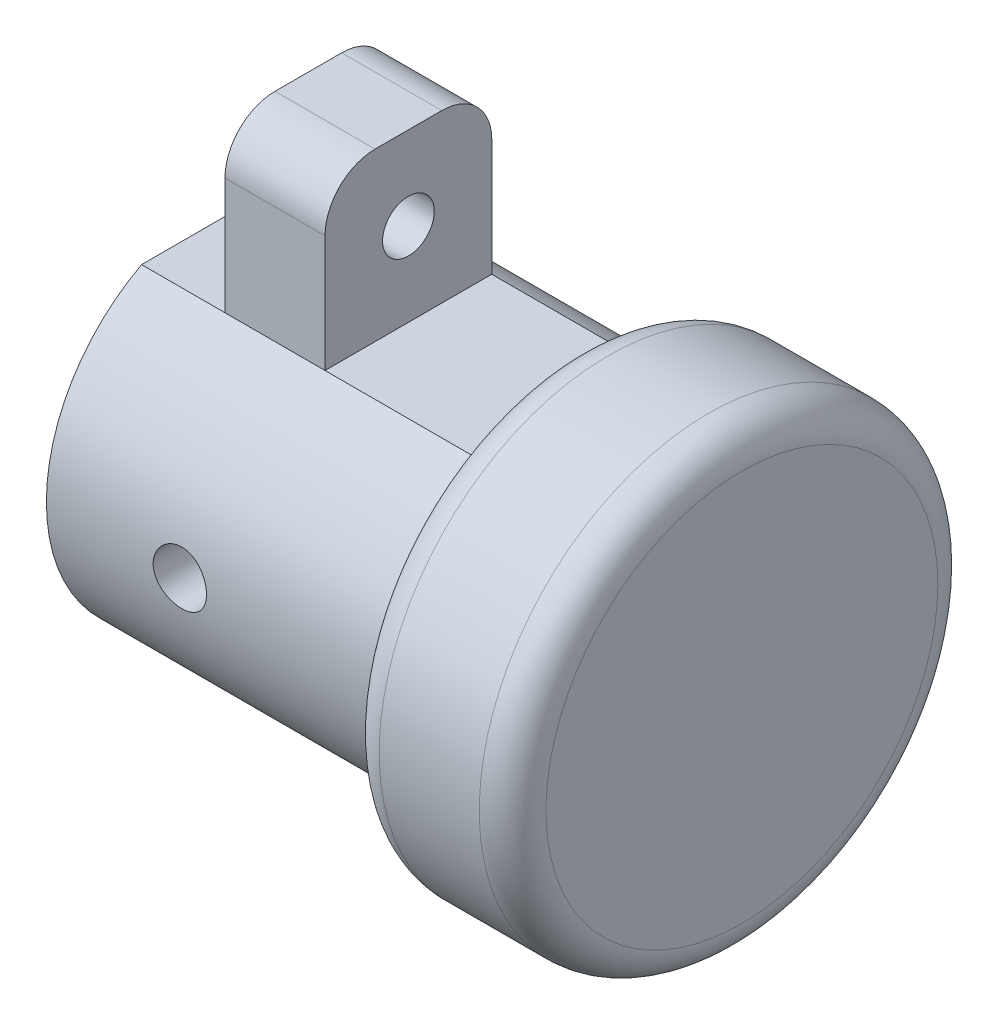
ISO-10303-21;
HEADER;
FILE_DESCRIPTION(('STEP AP214'),'2;1');
FILE_NAME('part.step','',(''),(''),'','','');
FILE_SCHEMA(('AUTOMOTIVE_DESIGN { 1 0 10303 214 1 1 1 1 }'));
ENDSEC;
DATA;
#1=APPLICATION_CONTEXT('core data for automotive mechanical design processes');
#2=APPLICATION_PROTOCOL_DEFINITION('international standard','automotive_design',2000,#1);
#3=PRODUCT_CONTEXT('',#1,'mechanical');
#4=PRODUCT('Part','Part','',(#3));
#5=PRODUCT_RELATED_PRODUCT_CATEGORY('part','',(#4));
#6=PRODUCT_DEFINITION_FORMATION('','',#4);
#7=PRODUCT_DEFINITION_CONTEXT('part definition',#1,'design');
#8=PRODUCT_DEFINITION('design','',#6,#7);
#9=PRODUCT_DEFINITION_SHAPE('','',#8);
#10=(LENGTH_UNIT() NAMED_UNIT(*) SI_UNIT(.MILLI.,.METRE.));
#11=(NAMED_UNIT(*) PLANE_ANGLE_UNIT() SI_UNIT($,.RADIAN.));
#12=(NAMED_UNIT(*) SI_UNIT($,.STERADIAN.) SOLID_ANGLE_UNIT());
#13=UNCERTAINTY_MEASURE_WITH_UNIT(LENGTH_MEASURE(1.E-05),#10,'distance_accuracy_value','');
#14=(GEOMETRIC_REPRESENTATION_CONTEXT(3) GLOBAL_UNCERTAINTY_ASSIGNED_CONTEXT((#13)) GLOBAL_UNIT_ASSIGNED_CONTEXT((#10,
#11,#12)) REPRESENTATION_CONTEXT('',''));
#15=CARTESIAN_POINT('',(0.,0.,0.));
#16=DIRECTION('',(0.,0.,1.));
#17=DIRECTION('',(1.,0.,0.));
#18=AXIS2_PLACEMENT_3D('',#15,#16,#17);
#19=CARTESIAN_POINT('',(16.,0.,0.));
#20=DIRECTION('',(-1.,0.,0.));
#21=DIRECTION('',(0.,0.,1.));
#22=AXIS2_PLACEMENT_3D('',#19,#20,#21);
#23=CYLINDRICAL_SURFACE('',#22,10.71);
#24=CARTESIAN_POINT('',(9.6,0.,10.71));
#25=CARTESIAN_POINT('',(9.59999631249962,-0.0893392863377918,10.709998572173));
#26=CARTESIAN_POINT('',(9.59249207613877,-0.178730516813415,10.7088704242097));
#27=CARTESIAN_POINT('',(9.56268083749038,-0.355014654532013,10.7044785929941));
#28=CARTESIAN_POINT('',(9.54035939450645,-0.441905038197179,10.7012128264842));
#29=CARTESIAN_POINT('',(9.48159535241211,-0.610610764880122,10.6929127804514));
#30=CARTESIAN_POINT('',(9.44516339569907,-0.69242987891695,10.6878798340334));
#31=CARTESIAN_POINT('',(9.35923843142557,-0.848780811301311,10.676601662275));
#32=CARTESIAN_POINT('',(9.30974724899632,-0.923313645971321,10.6703566063689));
#33=CARTESIAN_POINT('',(9.19869991100803,-1.06356662724988,10.6572946268811));
#34=CARTESIAN_POINT('',(9.13706251132156,-1.12922211326353,10.6504740397194));
#35=CARTESIAN_POINT('',(9.003647216643,-1.24929882645103,10.6370584182013));
#36=CARTESIAN_POINT('',(8.93186874062551,-1.30371940948946,10.6304633967953));
#37=CARTESIAN_POINT('',(8.77977473601831,-1.40003294470998,10.6182100523691));
#38=CARTESIAN_POINT('',(8.69941920835304,-1.44186338669871,10.6125564635773));
#39=CARTESIAN_POINT('',(8.53272434767541,-1.51140975635126,10.6028760739138));
#40=CARTESIAN_POINT('',(8.44638533842369,-1.53912644702067,10.5988491851034));
#41=CARTESIAN_POINT('',(8.27085416744198,-1.57945783802606,10.5929141208681));
#42=CARTESIAN_POINT('',(8.18168796631694,-1.59218319952214,10.5909904280236));
#43=CARTESIAN_POINT('',(8.00246662496982,-1.60251351325176,10.5894324415377));
#44=CARTESIAN_POINT('',(7.91241153567316,-1.60011932673892,10.5897980174929));
#45=CARTESIAN_POINT('',(7.73475020113145,-1.58036895177812,10.5927630734712));
#46=CARTESIAN_POINT('',(7.64712990709656,-1.56313597738507,10.5953441564517));
#47=CARTESIAN_POINT('',(7.47603862256453,-1.51439007005342,10.6024206653419));
#48=CARTESIAN_POINT('',(7.39256774865218,-1.48287673613596,10.6069161450059));
#49=CARTESIAN_POINT('',(7.23176964314886,-1.40633639408911,10.6173352540808));
#50=CARTESIAN_POINT('',(7.15446764222673,-1.36125716024578,10.6232643850783));
#51=CARTESIAN_POINT('',(7.00847853243833,-1.25890185076179,10.6358787482093));
#52=CARTESIAN_POINT('',(6.93979198495068,-1.20162498098466,10.6425640295593));
#53=CARTESIAN_POINT('',(6.81226941190883,-1.07582376829839,10.6560187260662));
#54=CARTESIAN_POINT('',(6.75353786689812,-1.00719348310619,10.662788317938));
#55=CARTESIAN_POINT('',(6.6484104361485,-0.860994778274062,10.675587267449));
#56=CARTESIAN_POINT('',(6.60201460364155,-0.783426320065532,10.6816166218939));
#57=CARTESIAN_POINT('',(6.5228703697534,-0.621462851975752,10.6922619780988));
#58=CARTESIAN_POINT('',(6.49012998981266,-0.537063864383369,10.6968771487226));
#59=CARTESIAN_POINT('',(6.43931666673816,-0.363881286667943,10.7041671677796));
#60=CARTESIAN_POINT('',(6.42124274010131,-0.275097990971488,10.7068421463169));
#61=CARTESIAN_POINT('',(6.40041421491459,-0.096568814905586,10.7099331601436));
#62=CARTESIAN_POINT('',(6.3975159690397,-0.00684004667508931,10.710370376361));
#63=CARTESIAN_POINT('',(6.4067398486872,0.171822232056323,10.7089942472345));
#64=CARTESIAN_POINT('',(6.41886151308142,0.260755766887371,10.7071809709833));
#65=CARTESIAN_POINT('',(6.45766167787525,0.43486826809352,10.7015207020652));
#66=CARTESIAN_POINT('',(6.4842702335413,0.520063166355989,10.6976834840284));
#67=CARTESIAN_POINT('',(6.55121512885649,0.684782451776511,10.6884042142537));
#68=CARTESIAN_POINT('',(6.59155210867936,0.764306574289937,10.6829620876785));
#69=CARTESIAN_POINT('',(6.68514611618925,0.916058818693131,10.6710251877014));
#70=CARTESIAN_POINT('',(6.73849431198518,0.988230126161438,10.6645230988209));
#71=CARTESIAN_POINT('',(6.85646940804102,1.12264658556525,10.6512128610829));
#72=CARTESIAN_POINT('',(6.92109695821863,1.18489116512579,10.6444046946059));
#73=CARTESIAN_POINT('',(7.06043553976582,1.29820961273836,10.6311825098308));
#74=CARTESIAN_POINT('',(7.13522526498764,1.34918721595353,10.6247722012362));
#75=CARTESIAN_POINT('',(7.29239049178092,1.4378556239892,10.6131371171605));
#76=CARTESIAN_POINT('',(7.37476578962586,1.47554678551391,10.6079123098532));
#77=CARTESIAN_POINT('',(7.54447615867616,1.53642302488711,10.5992666120658));
#78=CARTESIAN_POINT('',(7.63179268897914,1.55965885607379,10.595839416814));
#79=CARTESIAN_POINT('',(7.8091437773277,1.59112643738261,10.5911601832474));
#80=CARTESIAN_POINT('',(7.89917814889041,1.59935921456121,10.5899079960395));
#81=CARTESIAN_POINT('',(8.07844971983847,1.60056270329776,10.589726083362));
#82=CARTESIAN_POINT('',(8.16768591664139,1.59368477278815,10.5907733253654));
#83=CARTESIAN_POINT('',(8.34371736198404,1.56518633674034,10.5950222303468));
#84=CARTESIAN_POINT('',(8.43051261431031,1.54356585407305,10.5982238899825));
#85=CARTESIAN_POINT('',(8.59915700056349,1.48624940224989,10.6064128558492));
#86=CARTESIAN_POINT('',(8.6810097696054,1.45056392673406,10.6113988305799));
#87=CARTESIAN_POINT('',(8.83759085727842,1.36614552510704,10.622596268656));
#88=CARTESIAN_POINT('',(8.91231893849098,1.31741216440238,10.6288077728189));
#89=CARTESIAN_POINT('',(9.05329851906904,1.20773114463465,10.6418304729342));
#90=CARTESIAN_POINT('',(9.11946232293033,1.14667136479746,10.6486468259776));
#91=CARTESIAN_POINT('',(9.24065834371271,1.01430768159209,10.6620680742037));
#92=CARTESIAN_POINT('',(9.29568796883469,0.943001399648168,10.6686729198514));
#93=CARTESIAN_POINT('',(9.39332154312635,0.791711288148564,10.6809681077745));
#94=CARTESIAN_POINT('',(9.43585604455767,0.711682227357587,10.6866532627608));
#95=CARTESIAN_POINT('',(9.50681613891792,0.545568919796068,10.696417602142));
#96=CARTESIAN_POINT('',(9.53525636330006,0.459491058839355,10.7004984510742));
#97=CARTESIAN_POINT('',(9.57075928734636,0.310854646047107,10.7056614964362));
#98=CARTESIAN_POINT('',(9.5817078226596,0.249214106377617,10.7072800907872));
#99=CARTESIAN_POINT('',(9.5963294250377,0.125057522592236,10.7094498357885));
#100=CARTESIAN_POINT('',(9.60000258141491,0.06254148923337,10.7100009995426));
#101=CARTESIAN_POINT('',(9.6,0.,10.71));
#102=B_SPLINE_CURVE_WITH_KNOTS('',3,(#24,#25,#26,#27,#28,#29,#30,#31,#32,#33,#34,#35,#36,#37,
#38,#39,#40,#41,#42,#43,#44,#45,#46,#47,#48,#49,#50,#51,#52,#53,#54,#55,#56,#57,#58,#59,#60,#61,
#62,#63,#64,#65,#66,#67,#68,#69,#70,#71,#72,#73,#74,#75,#76,#77,#78,#79,#80,#81,#82,#83,#84,#85,
#86,#87,#88,#89,#90,#91,#92,#93,#94,#95,#96,#97,#98,#99,#100,#101),.UNSPECIFIED.,.T.,.F.,(4,2,2,
2,2,2,2,2,2,2,2,2,2,2,2,2,2,2,2,2,2,2,2,2,2,2,2,2,2,2,2,2,2,2,2,2,2,2,4),(0.,0.267789327919353,
0.535840024473879,0.803688944938174,1.07150045118321,1.34116814235607,1.61085129020878,
1.88185213070942,2.15283831903803,2.42181138493036,2.69076912946943,2.95751488264728,
3.22426812625544,3.49206174173954,3.75987279746638,4.03034063846066,4.30080964657879,
4.57143730969666,4.84204682356337,5.11009015687831,5.37812526116516,5.64487758488071,
5.91164234929817,6.18033289726733,6.44903893233175,6.7199589270328,6.99087164772735,
7.26082773206369,7.53076533545912,7.79801141987221,8.06525708969322,8.33230374857829,
8.59935930324803,8.86896331738754,9.13863001756641,9.40976833252188,9.68062458252903,
9.86809136961154,10.0555558553424),.UNSPECIFIED.);
#103=CARTESIAN_POINT('',(9.6,0.,10.71));
#104=VERTEX_POINT('',#103);
#105=EDGE_CURVE('E211',#104,#104,#102,.T.);
#106=ORIENTED_EDGE('',*,*,#105,.T.);
#107=EDGE_LOOP('',(#106));
#108=FACE_BOUND('',#107,.T.);
#109=CARTESIAN_POINT('',(9.6,0.,-10.71));
#110=CARTESIAN_POINT('',(9.59999631249962,0.089339286337799,-10.709998572173));
#111=CARTESIAN_POINT('',(9.59249207613877,0.178730516813422,-10.7088704242097));
#112=CARTESIAN_POINT('',(9.56268083749038,0.35501465453202,-10.7044785929941));
#113=CARTESIAN_POINT('',(9.54035939450645,0.441905038197187,-10.7012128264842));
#114=CARTESIAN_POINT('',(9.48159535241212,0.61061076488013,-10.6929127804514));
#115=CARTESIAN_POINT('',(9.44516339569907,0.692429878916958,-10.6878798340334));
#116=CARTESIAN_POINT('',(9.35923843142558,0.84878081130132,-10.676601662275));
#117=CARTESIAN_POINT('',(9.30974724899633,0.92331364597133,-10.6703566063689));
#118=CARTESIAN_POINT('',(9.19869991100804,1.06356662724989,-10.6572946268811));
#119=CARTESIAN_POINT('',(9.13706251132156,1.12922211326354,-10.6504740397194));
#120=CARTESIAN_POINT('',(9.00364721664301,1.24929882645104,-10.6370584182013));
#121=CARTESIAN_POINT('',(8.93186874062551,1.30371940948947,-10.6304633967953));
#122=CARTESIAN_POINT('',(8.77977473601832,1.40003294470999,-10.6182100523691));
#123=CARTESIAN_POINT('',(8.69941920835305,1.44186338669872,-10.6125564635773));
#124=CARTESIAN_POINT('',(8.53272434767542,1.51140975635128,-10.6028760739138));
#125=CARTESIAN_POINT('',(8.44638533842369,1.53912644702068,-10.5988491851034));
#126=CARTESIAN_POINT('',(8.27085416744198,1.57945783802607,-10.5929141208681));
#127=CARTESIAN_POINT('',(8.18168796631695,1.59218319952215,-10.5909904280236));
#128=CARTESIAN_POINT('',(8.00246662496982,1.60251351325177,-10.5894324415377));
#129=CARTESIAN_POINT('',(7.91241153567316,1.60011932673894,-10.5897980174929));
#130=CARTESIAN_POINT('',(7.73475020113146,1.58036895177814,-10.5927630734712));
#131=CARTESIAN_POINT('',(7.64712990709656,1.56313597738509,-10.5953441564517));
#132=CARTESIAN_POINT('',(7.47603862256453,1.51439007005344,-10.6024206653419));
#133=CARTESIAN_POINT('',(7.39256774865219,1.48287673613598,-10.6069161450059));
#134=CARTESIAN_POINT('',(7.23176964314887,1.40633639408913,-10.6173352540808));
#135=CARTESIAN_POINT('',(7.15446764222674,1.3612571602458,-10.6232643850783));
#136=CARTESIAN_POINT('',(7.00847853243834,1.25890185076181,-10.6358787482093));
#137=CARTESIAN_POINT('',(6.93979198495068,1.20162498098468,-10.6425640295593));
#138=CARTESIAN_POINT('',(6.81226941190883,1.07582376829841,-10.6560187260662));
#139=CARTESIAN_POINT('',(6.75353786689813,1.00719348310621,-10.662788317938));
#140=CARTESIAN_POINT('',(6.6484104361485,0.860994778274082,-10.675587267449));
#141=CARTESIAN_POINT('',(6.60201460364156,0.783426320065553,-10.6816166218939));
#142=CARTESIAN_POINT('',(6.5228703697534,0.621462851975773,-10.6922619780988));
#143=CARTESIAN_POINT('',(6.49012998981266,0.53706386438339,-10.6968771487226));
#144=CARTESIAN_POINT('',(6.43931666673816,0.363881286667965,-10.7041671677796));
#145=CARTESIAN_POINT('',(6.42124274010131,0.27509799097151,-10.7068421463169));
#146=CARTESIAN_POINT('',(6.40041421491459,0.0965688149056078,-10.7099331601436));
#147=CARTESIAN_POINT('',(6.39751596903971,0.00684004667511077,-10.710370376361));
#148=CARTESIAN_POINT('',(6.4067398486872,-0.171822232056302,-10.7089942472345));
#149=CARTESIAN_POINT('',(6.41886151308142,-0.260755766887349,-10.7071809709833));
#150=CARTESIAN_POINT('',(6.45766167787524,-0.434868268093498,-10.7015207020652));
#151=CARTESIAN_POINT('',(6.4842702335413,-0.520063166355967,-10.6976834840284));
#152=CARTESIAN_POINT('',(6.55121512885648,-0.684782451776489,-10.6884042142537));
#153=CARTESIAN_POINT('',(6.59155210867935,-0.764306574289916,-10.6829620876785));
#154=CARTESIAN_POINT('',(6.68514611618925,-0.91605881869311,-10.6710251877014));
#155=CARTESIAN_POINT('',(6.73849431198518,-0.988230126161417,-10.6645230988209));
#156=CARTESIAN_POINT('',(6.85646940804101,-1.12264658556523,-10.6512128610829));
#157=CARTESIAN_POINT('',(6.92109695821863,-1.18489116512577,-10.6444046946059));
#158=CARTESIAN_POINT('',(7.06043553976582,-1.29820961273834,-10.6311825098308));
#159=CARTESIAN_POINT('',(7.13522526498763,-1.34918721595351,-10.6247722012362));
#160=CARTESIAN_POINT('',(7.29239049178092,-1.43785562398918,-10.6131371171605));
#161=CARTESIAN_POINT('',(7.37476578962585,-1.4755467855139,-10.6079123098532));
#162=CARTESIAN_POINT('',(7.54447615867615,-1.5364230248871,-10.5992666120658));
#163=CARTESIAN_POINT('',(7.63179268897913,-1.55965885607377,-10.595839416814));
#164=CARTESIAN_POINT('',(7.80914377732769,-1.59112643738259,-10.5911601832474));
#165=CARTESIAN_POINT('',(7.8991781488904,-1.59935921456119,-10.5899079960395));
#166=CARTESIAN_POINT('',(8.07844971983847,-1.60056270329774,-10.589726083362));
#167=CARTESIAN_POINT('',(8.16768591664139,-1.59368477278813,-10.5907733253654));
#168=CARTESIAN_POINT('',(8.34371736198403,-1.56518633674033,-10.5950222303468));
#169=CARTESIAN_POINT('',(8.4305126143103,-1.54356585407304,-10.5982238899825));
#170=CARTESIAN_POINT('',(8.59915700056348,-1.48624940224988,-10.6064128558492));
#171=CARTESIAN_POINT('',(8.68100976960539,-1.45056392673404,-10.6113988305799));
#172=CARTESIAN_POINT('',(8.83759085727841,-1.36614552510703,-10.622596268656));
#173=CARTESIAN_POINT('',(8.91231893849097,-1.31741216440237,-10.6288077728189));
#174=CARTESIAN_POINT('',(9.05329851906903,-1.20773114463464,-10.6418304729342));
#175=CARTESIAN_POINT('',(9.11946232293032,-1.14667136479745,-10.6486468259776));
#176=CARTESIAN_POINT('',(9.24065834371271,-1.01430768159208,-10.6620680742037));
#177=CARTESIAN_POINT('',(9.29568796883468,-0.943001399648159,-10.6686729198514));
#178=CARTESIAN_POINT('',(9.39332154312635,-0.791711288148554,-10.6809681077745));
#179=CARTESIAN_POINT('',(9.43585604455767,-0.711682227357577,-10.6866532627608));
#180=CARTESIAN_POINT('',(9.50681613891792,-0.545568919796058,-10.696417602142));
#181=CARTESIAN_POINT('',(9.53525636330006,-0.459491058839346,-10.7004984510742));
#182=CARTESIAN_POINT('',(9.57075928734636,-0.310854646047099,-10.7056614964362));
#183=CARTESIAN_POINT('',(9.5817078226596,-0.24921410637761,-10.7072800907872));
#184=CARTESIAN_POINT('',(9.59632942503769,-0.125057522592229,-10.7094498357885));
#185=CARTESIAN_POINT('',(9.60000258141491,-0.0625414892333628,-10.7100009995426));
#186=CARTESIAN_POINT('',(9.6,0.,-10.71));
#187=B_SPLINE_CURVE_WITH_KNOTS('',3,(#109,#110,#111,#112,#113,#114,#115,#116,#117,#118,#119,
#120,#121,#122,#123,#124,#125,#126,#127,#128,#129,#130,#131,#132,#133,#134,#135,#136,#137,#138,
#139,#140,#141,#142,#143,#144,#145,#146,#147,#148,#149,#150,#151,#152,#153,#154,#155,#156,#157,
#158,#159,#160,#161,#162,#163,#164,#165,#166,#167,#168,#169,#170,#171,#172,#173,#174,#175,#176,
#177,#178,#179,#180,#181,#182,#183,#184,#185,#186),.UNSPECIFIED.,.T.,.F.,(4,2,2,2,2,2,2,2,2,2,2,
2,2,2,2,2,2,2,2,2,2,2,2,2,2,2,2,2,2,2,2,2,2,2,2,2,2,2,4),(0.,0.267789327919352,
0.535840024473879,0.803688944938174,1.07150045118321,1.34116814235607,1.61085129020878,
1.88185213070943,2.15283831903803,2.42181138493036,2.69076912946944,2.95751488264728,
3.22426812625544,3.49206174173954,3.75987279746638,4.03034063846066,4.30080964657879,
4.57143730969666,4.84204682356337,5.11009015687831,5.37812526116516,5.64487758488071,
5.91164234929817,6.18033289726733,6.44903893233175,6.7199589270328,6.99087164772735,
7.26082773206369,7.53076533545912,7.79801141987222,8.06525708969322,8.33230374857829,
8.59935930324803,8.86896331738754,9.13863001756642,9.40976833252189,9.68062458252903,
9.86809136961154,10.0555558553424),.UNSPECIFIED.);
#188=CARTESIAN_POINT('',(9.6,0.,-10.71));
#189=VERTEX_POINT('',#188);
#190=EDGE_CURVE('E218',#189,#189,#187,.T.);
#191=ORIENTED_EDGE('',*,*,#190,.T.);
#192=EDGE_LOOP('',(#191));
#193=FACE_BOUND('',#192,.T.);
#194=CARTESIAN_POINT('',(21.,0.,0.));
#195=DIRECTION('',(1.,0.,0.));
#196=DIRECTION('',(0.,0.,-1.));
#197=AXIS2_PLACEMENT_3D('',#194,#195,#196);
#198=CIRCLE('',#197,10.71);
#199=CARTESIAN_POINT('',(21.,9.47122484159256,4.99999999999999));
#200=VERTEX_POINT('',#199);
#201=CARTESIAN_POINT('',(21.,9.47122484159256,-5.));
#202=VERTEX_POINT('',#201);
#203=EDGE_CURVE('E148',#200,#202,#198,.T.);
#204=ORIENTED_EDGE('',*,*,#203,.F.);
#205=DIRECTION('',(-1.,0.,0.));
#206=VECTOR('',#205,1.);
#207=CARTESIAN_POINT('',(16.,9.47122484159256,5.));
#208=LINE('',#207,#206);
#209=CARTESIAN_POINT('',(11.,9.47122484159256,4.99999999999999));
#210=VERTEX_POINT('',#209);
#211=EDGE_CURVE('E134',#200,#210,#208,.T.);
#212=ORIENTED_EDGE('',*,*,#211,.T.);
#213=CARTESIAN_POINT('',(5.,9.47122484159256,4.99999999999999));
#214=VERTEX_POINT('',#213);
#215=EDGE_CURVE('E145',#210,#214,#208,.T.);
#216=ORIENTED_EDGE('',*,*,#215,.T.);
#217=DIRECTION('',(1.,0.,0.));
#218=VECTOR('',#217,1.);
#219=CARTESIAN_POINT('',(0.,9.47122484159256,4.99999999999999));
#220=LINE('',#219,#218);
#221=CARTESIAN_POINT('',(0.,9.47122484159256,5.));
#222=VERTEX_POINT('',#221);
#223=EDGE_CURVE('E275',#222,#214,#220,.T.);
#224=ORIENTED_EDGE('',*,*,#223,.F.);
#225=CARTESIAN_POINT('',(0.,0.,0.));
#226=DIRECTION('',(1.,0.,0.));
#227=DIRECTION('',(0.,0.,-1.));
#228=AXIS2_PLACEMENT_3D('',#225,#226,#227);
#229=CIRCLE('',#228,10.71);
#230=CARTESIAN_POINT('',(0.,9.47122484159256,-5.00000000000001));
#231=VERTEX_POINT('',#230);
#232=EDGE_CURVE('E267',#222,#231,#229,.T.);
#233=ORIENTED_EDGE('',*,*,#232,.T.);
#234=DIRECTION('',(-1.,0.,0.));
#235=VECTOR('',#234,1.);
#236=CARTESIAN_POINT('',(0.,9.47122484159256,-5.00000000000001));
#237=LINE('',#236,#235);
#238=CARTESIAN_POINT('',(5.,9.47122484159256,-5.00000000000001));
#239=VERTEX_POINT('',#238);
#240=EDGE_CURVE('E287',#239,#231,#237,.T.);
#241=ORIENTED_EDGE('',*,*,#240,.F.);
#242=DIRECTION('',(-1.,0.,0.));
#243=VECTOR('',#242,1.);
#244=CARTESIAN_POINT('',(16.,9.47122484159256,-5.));
#245=LINE('',#244,#243);
#246=CARTESIAN_POINT('',(11.,9.47122484159256,-5.00000000000001));
#247=VERTEX_POINT('',#246);
#248=EDGE_CURVE('E144',#247,#239,#245,.T.);
#249=ORIENTED_EDGE('',*,*,#248,.F.);
#250=EDGE_CURVE('E150',#202,#247,#245,.T.);
#251=ORIENTED_EDGE('',*,*,#250,.F.);
#252=EDGE_LOOP('',(#204,#212,#216,#224,#233,#241,#249,#251));
#253=FACE_BOUND('',#252,.T.);
#254=ADVANCED_FACE('F68',(#108,#193,#253),#23,.T.);
#255=CARTESIAN_POINT('',(0.,9.47122484159256,0.));
#256=DIRECTION('',(0.,-1.,0.));
#257=DIRECTION('',(0.,0.,-1.));
#258=AXIS2_PLACEMENT_3D('',#255,#256,#257);
#259=PLANE('',#258);
#260=DIRECTION('',(0.,0.,1.));
#261=VECTOR('',#260,1.);
#262=CARTESIAN_POINT('',(21.,9.47122484159256,0.));
#263=LINE('',#262,#261);
#264=EDGE_CURVE('E84',#202,#200,#263,.T.);
#265=ORIENTED_EDGE('',*,*,#264,.F.);
#266=ORIENTED_EDGE('',*,*,#250,.T.);
#267=DIRECTION('',(0.,0.,1.));
#268=VECTOR('',#267,1.);
#269=CARTESIAN_POINT('',(11.,9.47122484159256,-5.00000000000001));
#270=LINE('',#269,#268);
#271=EDGE_CURVE('E138',#247,#210,#270,.T.);
#272=ORIENTED_EDGE('',*,*,#271,.T.);
#273=ORIENTED_EDGE('',*,*,#211,.F.);
#274=EDGE_LOOP('',(#265,#266,#272,#273));
#275=FACE_BOUND('',#274,.T.);
#276=ADVANCED_FACE('F136',(#275),#259,.F.);
#277=CARTESIAN_POINT('',(0.,0.,0.));
#278=DIRECTION('',(1.,0.,0.));
#279=DIRECTION('',(0.,0.,-1.));
#280=AXIS2_PLACEMENT_3D('',#277,#278,#279);
#281=PLANE('',#280);
#282=CARTESIAN_POINT('',(0.,0.,0.));
#283=DIRECTION('',(1.,0.,0.));
#284=DIRECTION('',(0.,0.,-1.));
#285=AXIS2_PLACEMENT_3D('',#282,#283,#284);
#286=CIRCLE('',#285,7.71);
#287=CARTESIAN_POINT('',(0.,0.,-7.71));
#288=VERTEX_POINT('',#287);
#289=EDGE_CURVE('E257',#288,#288,#286,.T.);
#290=ORIENTED_EDGE('',*,*,#289,.T.);
#291=EDGE_LOOP('',(#290));
#292=FACE_BOUND('',#291,.T.);
#293=DIRECTION('',(0.,0.,1.));
#294=VECTOR('',#293,1.);
#295=CARTESIAN_POINT('',(0.,9.47122484159256,-5.00000000000001));
#296=LINE('',#295,#294);
#297=EDGE_CURVE('E310',#231,#222,#296,.T.);
#298=ORIENTED_EDGE('',*,*,#297,.F.);
#299=ORIENTED_EDGE('',*,*,#232,.F.);
#300=EDGE_LOOP('',(#298,#299));
#301=FACE_BOUND('',#300,.T.);
#302=ADVANCED_FACE('F197',(#292,#301),#281,.F.);
#303=CARTESIAN_POINT('',(16.,0.,-5.));
#304=DIRECTION('',(0.,0.,1.));
#305=DIRECTION('',(1.,0.,0.));
#306=AXIS2_PLACEMENT_3D('',#303,#304,#305);
#307=PLANE('',#306);
#308=DIRECTION('',(0.,1.,0.));
#309=VECTOR('',#308,1.);
#310=CARTESIAN_POINT('',(5.,9.47122484159256,-5.00000000000001));
#311=LINE('',#310,#309);
#312=CARTESIAN_POINT('',(5.,16.4712248415926,-5.00000000000001));
#313=VERTEX_POINT('',#312);
#314=EDGE_CURVE('E286',#239,#313,#311,.T.);
#315=ORIENTED_EDGE('',*,*,#314,.T.);
#316=DIRECTION('',(-1.,0.,0.));
#317=VECTOR('',#316,1.);
#318=CARTESIAN_POINT('',(11.,16.4712248415926,-5.));
#319=LINE('',#318,#317);
#320=CARTESIAN_POINT('',(11.,16.4712248415926,-5.00000000000001));
#321=VERTEX_POINT('',#320);
#322=EDGE_CURVE('E92',#313,#321,#319,.F.);
#323=ORIENTED_EDGE('',*,*,#322,.T.);
#324=DIRECTION('',(0.,1.,0.));
#325=VECTOR('',#324,1.);
#326=CARTESIAN_POINT('',(11.,9.47122484159256,-5.00000000000001));
#327=LINE('',#326,#325);
#328=EDGE_CURVE('E296',#247,#321,#327,.T.);
#329=ORIENTED_EDGE('',*,*,#328,.F.);
#330=ORIENTED_EDGE('',*,*,#248,.T.);
#331=EDGE_LOOP('',(#315,#323,#329,#330));
#332=FACE_BOUND('',#331,.T.);
#333=ADVANCED_FACE('F324',(#332),#307,.F.);
#334=CARTESIAN_POINT('',(16.,19.4712248415926,0.));
#335=DIRECTION('',(0.,1.,0.));
#336=DIRECTION('',(0.,0.,1.));
#337=AXIS2_PLACEMENT_3D('',#334,#335,#336);
#338=PLANE('',#337);
#339=DIRECTION('',(0.,0.,-1.));
#340=VECTOR('',#339,1.);
#341=CARTESIAN_POINT('',(5.,19.4712248415926,-5.00000000000001));
#342=LINE('',#341,#340);
#343=CARTESIAN_POINT('',(5.,19.4712248415926,2.));
#344=VERTEX_POINT('',#343);
#345=CARTESIAN_POINT('',(5.,19.4712248415926,-2.));
#346=VERTEX_POINT('',#345);
#347=EDGE_CURVE('E303',#344,#346,#342,.T.);
#348=ORIENTED_EDGE('',*,*,#347,.F.);
#349=DIRECTION('',(-1.,0.,0.));
#350=VECTOR('',#349,1.);
#351=CARTESIAN_POINT('',(16.,19.4712248415926,2.));
#352=LINE('',#351,#350);
#353=CARTESIAN_POINT('',(11.,19.4712248415926,2.));
#354=VERTEX_POINT('',#353);
#355=EDGE_CURVE('E341',#344,#354,#352,.F.);
#356=ORIENTED_EDGE('',*,*,#355,.T.);
#357=DIRECTION('',(0.,0.,1.));
#358=VECTOR('',#357,1.);
#359=CARTESIAN_POINT('',(11.,19.4712248415926,-5.00000000000001));
#360=LINE('',#359,#358);
#361=CARTESIAN_POINT('',(11.,19.4712248415926,-2.));
#362=VERTEX_POINT('',#361);
#363=EDGE_CURVE('E300',#362,#354,#360,.T.);
#364=ORIENTED_EDGE('',*,*,#363,.F.);
#365=DIRECTION('',(-1.,0.,0.));
#366=VECTOR('',#365,1.);
#367=CARTESIAN_POINT('',(5.,19.4712248415926,-2.));
#368=LINE('',#367,#366);
#369=EDGE_CURVE('E343',#362,#346,#368,.T.);
#370=ORIENTED_EDGE('',*,*,#369,.T.);
#371=EDGE_LOOP('',(#348,#356,#364,#370));
#372=FACE_BOUND('',#371,.T.);
#373=ADVANCED_FACE('F331',(#372),#338,.T.);
#374=CARTESIAN_POINT('',(16.,0.,5.));
#375=DIRECTION('',(0.,0.,1.));
#376=DIRECTION('',(1.,0.,0.));
#377=AXIS2_PLACEMENT_3D('',#374,#375,#376);
#378=PLANE('',#377);
#379=DIRECTION('',(0.,1.,0.));
#380=VECTOR('',#379,1.);
#381=CARTESIAN_POINT('',(11.,9.47122484159256,4.99999999999999));
#382=LINE('',#381,#380);
#383=CARTESIAN_POINT('',(11.,16.4712248415926,4.99999999999999));
#384=VERTEX_POINT('',#383);
#385=EDGE_CURVE('E264',#210,#384,#382,.T.);
#386=ORIENTED_EDGE('',*,*,#385,.T.);
#387=DIRECTION('',(-1.,0.,0.));
#388=VECTOR('',#387,1.);
#389=CARTESIAN_POINT('',(16.,16.4712248415926,5.));
#390=LINE('',#389,#388);
#391=CARTESIAN_POINT('',(5.,16.4712248415926,4.99999999999999));
#392=VERTEX_POINT('',#391);
#393=EDGE_CURVE('E225',#384,#392,#390,.T.);
#394=ORIENTED_EDGE('',*,*,#393,.T.);
#395=DIRECTION('',(0.,1.,0.));
#396=VECTOR('',#395,1.);
#397=CARTESIAN_POINT('',(5.,9.47122484159256,4.99999999999999));
#398=LINE('',#397,#396);
#399=EDGE_CURVE('E283',#214,#392,#398,.T.);
#400=ORIENTED_EDGE('',*,*,#399,.F.);
#401=ORIENTED_EDGE('',*,*,#215,.F.);
#402=EDGE_LOOP('',(#386,#394,#400,#401));
#403=FACE_BOUND('',#402,.T.);
#404=ADVANCED_FACE('F279',(#403),#378,.T.);
#405=CARTESIAN_POINT('',(16.,0.,0.));
#406=DIRECTION('',(-1.,0.,0.));
#407=DIRECTION('',(0.,0.,1.));
#408=AXIS2_PLACEMENT_3D('',#405,#406,#407);
#409=CYLINDRICAL_SURFACE('',#408,7.71);
#410=CARTESIAN_POINT('',(9.6,0.,7.71));
#411=CARTESIAN_POINT('',(9.59999681863024,-0.0888514382127566,7.70999835565587));
#412=CARTESIAN_POINT('',(9.59257383246234,-0.17774238361294,7.7084483868283));
#413=CARTESIAN_POINT('',(9.56310442408262,-0.353006856673195,7.70241483595246));
#414=CARTESIAN_POINT('',(9.5410468416789,-0.439378410553564,7.6979290150892));
#415=CARTESIAN_POINT('',(9.48302288604294,-0.607045161444148,7.68652410190117));
#416=CARTESIAN_POINT('',(9.4470703103663,-0.688345301586618,7.67960742400287));
#417=CARTESIAN_POINT('',(9.36231904276439,-0.843755041837878,7.66409058322982));
#418=CARTESIAN_POINT('',(9.31352094498267,-0.917864974298216,7.65549049822235));
#419=CARTESIAN_POINT('',(9.20371285471823,-1.05787167532588,7.63741196366374));
#420=CARTESIAN_POINT('',(9.14255217664113,-1.12364898336259,7.62792353814856));
#421=CARTESIAN_POINT('',(9.01007881418301,-1.24408829460668,7.60920940042947));
#422=CARTESIAN_POINT('',(8.93876529521031,-1.29874938313205,7.59998370989799));
#423=CARTESIAN_POINT('',(8.78714188050948,-1.39592038683807,7.58274184371963));
#424=CARTESIAN_POINT('',(8.70675025081398,-1.43830524221578,7.5747384839818));
#425=CARTESIAN_POINT('',(8.53979253915256,-1.50891905757368,7.56098974221929));
#426=CARTESIAN_POINT('',(8.45322711803321,-1.53714953005809,7.55524411895238));
#427=CARTESIAN_POINT('',(8.27766860558845,-1.57826265412727,7.54676259823482));
#428=CARTESIAN_POINT('',(8.18872680862261,-1.59135566128296,7.54398549130058));
#429=CARTESIAN_POINT('',(8.00986895830011,-1.60247584988833,7.54163150991853));
#430=CARTESIAN_POINT('',(7.91995301348084,-1.60050469286109,7.54205428253548));
#431=CARTESIAN_POINT('',(7.7432478989506,-1.58172227052616,7.54601490218697));
#432=CARTESIAN_POINT('',(7.65643165287335,-1.56515339980174,7.54950186598908));
#433=CARTESIAN_POINT('',(7.48683850716729,-1.5180290439486,7.55911772788996));
#434=CARTESIAN_POINT('',(7.40406181396307,-1.48747284488197,7.56524676084366));
#435=CARTESIAN_POINT('',(7.24420566682501,-1.41301325445593,7.5795074581703));
#436=CARTESIAN_POINT('',(7.1671717548416,-1.36901491535958,7.58765328783006));
#437=CARTESIAN_POINT('',(7.02148994364156,-1.26898689623106,7.60502081662141));
#438=CARTESIAN_POINT('',(6.95284308041326,-1.21295573222812,7.61424264838887));
#439=CARTESIAN_POINT('',(6.82448653032059,-1.08916051892889,7.63294272685151));
#440=CARTESIAN_POINT('',(6.76497612931684,-1.02118988293769,7.64242247666688));
#441=CARTESIAN_POINT('',(6.65816877132837,-0.876128697831413,7.66040674557188));
#442=CARTESIAN_POINT('',(6.61087199486768,-0.799038013941604,7.66891125024583));
#443=CARTESIAN_POINT('',(6.52979278942385,-0.637695136171491,7.68401022570485));
#444=CARTESIAN_POINT('',(6.49603444393966,-0.55343050042004,7.69060128696933));
#445=CARTESIAN_POINT('',(6.44320986896253,-0.380258218882597,7.70110509598558));
#446=CARTESIAN_POINT('',(6.42414172056765,-0.291351181129351,7.70501819353796));
#447=CARTESIAN_POINT('',(6.4015239730494,-0.113129146320339,7.70967603875582));
#448=CARTESIAN_POINT('',(6.39770184700889,-0.0238501455730915,7.71047642050873));
#449=CARTESIAN_POINT('',(6.40494884313882,0.154070692699804,7.70897371914359));
#450=CARTESIAN_POINT('',(6.41601706092445,0.242712568593348,7.70667082450714));
#451=CARTESIAN_POINT('',(6.45250429497228,0.415954435146064,7.69925525539149));
#452=CARTESIAN_POINT('',(6.4777822588612,0.500585420356866,7.69417021084612));
#453=CARTESIAN_POINT('',(6.54181635228346,0.664407095316244,7.68175878355136));
#454=CARTESIAN_POINT('',(6.58057354788427,0.743597354166356,7.67443222352686));
#455=CARTESIAN_POINT('',(6.67104695829679,0.895430247061145,7.658212351984));
#456=CARTESIAN_POINT('',(6.72292569521241,0.96797394300308,7.64929984124385));
#457=CARTESIAN_POINT('',(6.83795335266218,1.10342388969498,7.63093939192149));
#458=CARTESIAN_POINT('',(6.90110358101138,1.16632902052027,7.62149139129405));
#459=CARTESIAN_POINT('',(7.03812628570277,1.28177811651958,7.60293544938852));
#460=CARTESIAN_POINT('',(7.11215825266534,1.33413433307232,7.59383567367413));
#461=CARTESIAN_POINT('',(7.26812543821126,1.425669840789,7.57718541681443));
#462=CARTESIAN_POINT('',(7.35006032872142,1.46484967863981,7.56963487139677));
#463=CARTESIAN_POINT('',(7.51908224961559,1.52867028086062,7.55700514561715));
#464=CARTESIAN_POINT('',(7.60613871514562,1.55338924086199,7.55191270003024));
#465=CARTESIAN_POINT('',(7.78328742276999,1.58782064700906,7.54474919806874));
#466=CARTESIAN_POINT('',(7.87337923258477,1.59753522085573,7.54267771330831));
#467=CARTESIAN_POINT('',(8.05215321102858,1.60159867026146,7.54181572883001));
#468=CARTESIAN_POINT('',(8.14082845377599,1.59624459398949,7.54296180034556));
#469=CARTESIAN_POINT('',(8.31598440075095,1.57098163979102,7.54826339857968));
#470=CARTESIAN_POINT('',(8.40246512568458,1.55107289924603,7.55241889689225));
#471=CARTESIAN_POINT('',(8.57056976038176,1.49740264823448,7.56324175293258));
#472=CARTESIAN_POINT('',(8.65220663959375,1.46368023613631,7.56990201682114));
#473=CARTESIAN_POINT('',(8.80870943483702,1.38337512402391,7.5849874840557));
#474=CARTESIAN_POINT('',(8.88357472740172,1.33679124143845,7.59341284968001));
#475=CARTESIAN_POINT('',(9.0258825964875,1.23108244984639,7.61127147310443));
#476=CARTESIAN_POINT('',(9.09316470563395,1.17174410988376,7.62072032345145));
#477=CARTESIAN_POINT('',(9.21691451408582,1.04264835734788,7.6394522180748));
#478=CARTESIAN_POINT('',(9.27337972078048,0.972888549862292,7.64873522368863));
#479=CARTESIAN_POINT('',(9.37450559055492,0.823971056277136,7.66621486267848));
#480=CARTESIAN_POINT('',(9.4190240138875,0.744715103776765,7.6743978722974));
#481=CARTESIAN_POINT('',(9.49403861462305,0.579696517569507,7.68862051297561));
#482=CARTESIAN_POINT('',(9.52454708955031,0.493939667506418,7.69466202271422));
#483=CARTESIAN_POINT('',(9.56495044874883,0.340025486385902,7.70278448005369));
#484=CARTESIAN_POINT('',(9.5780699632348,0.272728062150169,7.70547410696514));
#485=CARTESIAN_POINT('',(9.59559580636658,0.136961555596537,7.70908246846822));
#486=CARTESIAN_POINT('',(9.60000245240847,0.0684925160503922,7.7100012675683));
#487=CARTESIAN_POINT('',(9.6,0.,7.71));
#488=B_SPLINE_CURVE_WITH_KNOTS('',3,(#410,#411,#412,#413,#414,#415,#416,#417,#418,#419,#420,
#421,#422,#423,#424,#425,#426,#427,#428,#429,#430,#431,#432,#433,#434,#435,#436,#437,#438,#439,
#440,#441,#442,#443,#444,#445,#446,#447,#448,#449,#450,#451,#452,#453,#454,#455,#456,#457,#458,
#459,#460,#461,#462,#463,#464,#465,#466,#467,#468,#469,#470,#471,#472,#473,#474,#475,#476,#477,
#478,#479,#480,#481,#482,#483,#484,#485,#486,#487),.UNSPECIFIED.,.T.,.F.,(4,2,2,2,2,2,2,2,2,2,2,
2,2,2,2,2,2,2,2,2,2,2,2,2,2,2,2,2,2,2,2,2,2,2,2,2,2,2,4),(0.,0.266303693009479,
0.532810700242428,0.799053746461557,1.06528448031205,1.33498054064749,1.60469878356153,
1.87707512521926,2.14942235517238,2.41793765260999,2.68642333420431,2.95053311167811,
3.21465637128424,3.48069015890485,3.74675677450377,4.01798665818616,4.28922055056449,
4.56093482286768,4.83261359656693,5.09941367105302,5.36619754181361,5.63037880620616,
5.89458096935061,6.16223113327076,6.42991237246862,6.70200310793243,6.97408255298073,
7.24467682402072,7.5152327198438,7.78049271760675,8.04575021161243,8.31026204934963,
8.57479821621184,8.84416393898733,9.11359165902804,9.38609764010318,9.65836396399333,
9.86365579515156,10.0689401477138),.UNSPECIFIED.);
#489=CARTESIAN_POINT('',(9.6,0.,7.71));
#490=VERTEX_POINT('',#489);
#491=EDGE_CURVE('E249',#490,#490,#488,.T.);
#492=ORIENTED_EDGE('',*,*,#491,.F.);
#493=EDGE_LOOP('',(#492));
#494=FACE_BOUND('',#493,.T.);
#495=CARTESIAN_POINT('',(9.6,0.,-7.71));
#496=CARTESIAN_POINT('',(9.59999681863024,0.088851438212764,-7.70999835565587));
#497=CARTESIAN_POINT('',(9.59257383246234,0.177742383612947,-7.7084483868283));
#498=CARTESIAN_POINT('',(9.56310442408262,0.353006856673202,-7.70241483595246));
#499=CARTESIAN_POINT('',(9.5410468416789,0.439378410553571,-7.6979290150892));
#500=CARTESIAN_POINT('',(9.48302288604294,0.607045161444156,-7.68652410190117));
#501=CARTESIAN_POINT('',(9.4470703103663,0.688345301586626,-7.67960742400287));
#502=CARTESIAN_POINT('',(9.36231904276439,0.843755041837886,-7.66409058322981));
#503=CARTESIAN_POINT('',(9.31352094498267,0.917864974298225,-7.65549049822235));
#504=CARTESIAN_POINT('',(9.20371285471823,1.05787167532589,-7.63741196366374));
#505=CARTESIAN_POINT('',(9.14255217664114,1.1236489833626,-7.62792353814856));
#506=CARTESIAN_POINT('',(9.01007881418302,1.24408829460669,-7.60920940042947));
#507=CARTESIAN_POINT('',(8.93876529521031,1.29874938313206,-7.59998370989799));
#508=CARTESIAN_POINT('',(8.78714188050949,1.39592038683809,-7.58274184371963));
#509=CARTESIAN_POINT('',(8.70675025081398,1.43830524221579,-7.5747384839818));
#510=CARTESIAN_POINT('',(8.53979253915256,1.50891905757369,-7.56098974221929));
#511=CARTESIAN_POINT('',(8.45322711803321,1.53714953005811,-7.55524411895238));
#512=CARTESIAN_POINT('',(8.27766860558846,1.57826265412729,-7.54676259823482));
#513=CARTESIAN_POINT('',(8.18872680862262,1.59135566128297,-7.54398549130057));
#514=CARTESIAN_POINT('',(8.00986895830012,1.60247584988834,-7.54163150991852));
#515=CARTESIAN_POINT('',(7.91995301348085,1.60050469286111,-7.54205428253548));
#516=CARTESIAN_POINT('',(7.74324789895061,1.58172227052618,-7.54601490218697));
#517=CARTESIAN_POINT('',(7.65643165287336,1.56515339980176,-7.54950186598908));
#518=CARTESIAN_POINT('',(7.4868385071673,1.51802904394862,-7.55911772788995));
#519=CARTESIAN_POINT('',(7.40406181396308,1.48747284488199,-7.56524676084365));
#520=CARTESIAN_POINT('',(7.24420566682501,1.41301325445595,-7.57950745817029));
#521=CARTESIAN_POINT('',(7.16717175484161,1.3690149153596,-7.58765328783006));
#522=CARTESIAN_POINT('',(7.02148994364156,1.26898689623108,-7.60502081662141));
#523=CARTESIAN_POINT('',(6.95284308041327,1.21295573222814,-7.61424264838887));
#524=CARTESIAN_POINT('',(6.82448653032059,1.0891605189289,-7.6329427268515));
#525=CARTESIAN_POINT('',(6.76497612931684,1.02118988293771,-7.64242247666687));
#526=CARTESIAN_POINT('',(6.65816877132838,0.876128697831434,-7.66040674557188));
#527=CARTESIAN_POINT('',(6.61087199486769,0.799038013941625,-7.66891125024583));
#528=CARTESIAN_POINT('',(6.52979278942385,0.637695136171512,-7.68401022570485));
#529=CARTESIAN_POINT('',(6.49603444393966,0.553430500420061,-7.69060128696933));
#530=CARTESIAN_POINT('',(6.44320986896253,0.380258218882619,-7.70110509598558));
#531=CARTESIAN_POINT('',(6.42414172056765,0.291351181129373,-7.70501819353796));
#532=CARTESIAN_POINT('',(6.4015239730494,0.113129146320362,-7.70967603875582));
#533=CARTESIAN_POINT('',(6.39770184700889,0.0238501455731142,-7.71047642050873));
#534=CARTESIAN_POINT('',(6.40494884313882,-0.154070692699781,-7.70897371914359));
#535=CARTESIAN_POINT('',(6.41601706092445,-0.242712568593326,-7.70667082450714));
#536=CARTESIAN_POINT('',(6.45250429497228,-0.415954435146042,-7.69925525539149));
#537=CARTESIAN_POINT('',(6.4777822588612,-0.500585420356844,-7.69417021084612));
#538=CARTESIAN_POINT('',(6.54181635228346,-0.664407095316223,-7.68175878355136));
#539=CARTESIAN_POINT('',(6.58057354788426,-0.743597354166335,-7.67443222352686));
#540=CARTESIAN_POINT('',(6.67104695829679,-0.895430247061125,-7.658212351984));
#541=CARTESIAN_POINT('',(6.7229256952124,-0.96797394300306,-7.64929984124385));
#542=CARTESIAN_POINT('',(6.83795335266218,-1.10342388969496,-7.63093939192149));
#543=CARTESIAN_POINT('',(6.90110358101138,-1.16632902052025,-7.62149139129406));
#544=CARTESIAN_POINT('',(7.03812628570276,-1.28177811651956,-7.60293544938852));
#545=CARTESIAN_POINT('',(7.11215825266533,-1.3341343330723,-7.59383567367413));
#546=CARTESIAN_POINT('',(7.26812543821126,-1.42566984078898,-7.57718541681444));
#547=CARTESIAN_POINT('',(7.35006032872141,-1.46484967863979,-7.56963487139677));
#548=CARTESIAN_POINT('',(7.51908224961558,-1.5286702808606,-7.55700514561716));
#549=CARTESIAN_POINT('',(7.60613871514561,-1.55338924086197,-7.55191270003025));
#550=CARTESIAN_POINT('',(7.78328742276998,-1.58782064700904,-7.54474919806874));
#551=CARTESIAN_POINT('',(7.87337923258476,-1.59753522085571,-7.54267771330831));
#552=CARTESIAN_POINT('',(8.05215321102857,-1.60159867026144,-7.54181572883001));
#553=CARTESIAN_POINT('',(8.14082845377599,-1.59624459398947,-7.54296180034557));
#554=CARTESIAN_POINT('',(8.31598440075094,-1.57098163979101,-7.54826339857968));
#555=CARTESIAN_POINT('',(8.40246512568458,-1.55107289924602,-7.55241889689225));
#556=CARTESIAN_POINT('',(8.57056976038175,-1.49740264823447,-7.56324175293259));
#557=CARTESIAN_POINT('',(8.65220663959375,-1.4636802361363,-7.56990201682114));
#558=CARTESIAN_POINT('',(8.80870943483702,-1.3833751240239,-7.58498748405571));
#559=CARTESIAN_POINT('',(8.88357472740172,-1.33679124143844,-7.59341284968001));
#560=CARTESIAN_POINT('',(9.0258825964875,-1.23108244984638,-7.61127147310443));
#561=CARTESIAN_POINT('',(9.09316470563395,-1.17174410988375,-7.62072032345145));
#562=CARTESIAN_POINT('',(9.21691451408582,-1.04264835734787,-7.6394522180748));
#563=CARTESIAN_POINT('',(9.27337972078048,-0.972888549862281,-7.64873522368863));
#564=CARTESIAN_POINT('',(9.37450559055492,-0.823971056277125,-7.66621486267848));
#565=CARTESIAN_POINT('',(9.4190240138875,-0.744715103776754,-7.6743978722974));
#566=CARTESIAN_POINT('',(9.49403861462304,-0.579696517569496,-7.68862051297561));
#567=CARTESIAN_POINT('',(9.52454708955031,-0.493939667506408,-7.69466202271422));
#568=CARTESIAN_POINT('',(9.56495044874883,-0.340025486385894,-7.70278448005369));
#569=CARTESIAN_POINT('',(9.5780699632348,-0.272728062150161,-7.70547410696514));
#570=CARTESIAN_POINT('',(9.59559580636658,-0.136961555596529,-7.70908246846822));
#571=CARTESIAN_POINT('',(9.60000245240847,-0.0684925160503846,-7.7100012675683));
#572=CARTESIAN_POINT('',(9.6,0.,-7.71));
#573=B_SPLINE_CURVE_WITH_KNOTS('',3,(#495,#496,#497,#498,#499,#500,#501,#502,#503,#504,#505,
#506,#507,#508,#509,#510,#511,#512,#513,#514,#515,#516,#517,#518,#519,#520,#521,#522,#523,#524,
#525,#526,#527,#528,#529,#530,#531,#532,#533,#534,#535,#536,#537,#538,#539,#540,#541,#542,#543,
#544,#545,#546,#547,#548,#549,#550,#551,#552,#553,#554,#555,#556,#557,#558,#559,#560,#561,#562,
#563,#564,#565,#566,#567,#568,#569,#570,#571,#572),.UNSPECIFIED.,.T.,.F.,(4,2,2,2,2,2,2,2,2,2,2,
2,2,2,2,2,2,2,2,2,2,2,2,2,2,2,2,2,2,2,2,2,2,2,2,2,2,2,4),(0.,0.266303693009479,
0.532810700242429,0.799053746461558,1.06528448031205,1.33498054064749,1.60469878356154,
1.87707512521926,2.14942235517238,2.41793765260999,2.6864233342043,2.95053311167811,
3.21465637128424,3.48069015890485,3.74675677450377,4.01798665818616,4.28922055056449,
4.56093482286768,4.83261359656693,5.09941367105302,5.36619754181361,5.63037880620616,
5.89458096935061,6.16223113327076,6.42991237246862,6.70200310793243,6.97408255298073,
7.24467682402072,7.5152327198438,7.78049271760676,8.04575021161243,8.31026204934963,
8.57479821621185,8.84416393898734,9.11359165902804,9.38609764010318,9.65836396399334,
9.86365579515156,10.0689401477138),.UNSPECIFIED.);
#574=CARTESIAN_POINT('',(9.6,0.,-7.71));
#575=VERTEX_POINT('',#574);
#576=EDGE_CURVE('E242',#575,#575,#573,.T.);
#577=ORIENTED_EDGE('',*,*,#576,.F.);
#578=EDGE_LOOP('',(#577));
#579=FACE_BOUND('',#578,.T.);
#580=CARTESIAN_POINT('',(16.,0.,0.));
#581=DIRECTION('',(1.,0.,0.));
#582=DIRECTION('',(0.,0.,-1.));
#583=AXIS2_PLACEMENT_3D('',#580,#581,#582);
#584=CIRCLE('',#583,7.71);
#585=CARTESIAN_POINT('',(16.,0.,-7.71));
#586=VERTEX_POINT('',#585);
#587=EDGE_CURVE('E153',#586,#586,#584,.T.);
#588=ORIENTED_EDGE('',*,*,#587,.T.);
#589=EDGE_LOOP('',(#588));
#590=FACE_BOUND('',#589,.T.);
#591=ORIENTED_EDGE('',*,*,#289,.F.);
#592=EDGE_LOOP('',(#591));
#593=FACE_BOUND('',#592,.T.);
#594=ADVANCED_FACE('F204',(#494,#579,#590,#593),#409,.F.);
#595=CARTESIAN_POINT('',(8.,0.,-10.71));
#596=DIRECTION('',(0.,0.,1.));
#597=DIRECTION('',(1.,0.,0.));
#598=AXIS2_PLACEMENT_3D('',#595,#596,#597);
#599=CYLINDRICAL_SURFACE('',#598,1.6);
#600=ORIENTED_EDGE('',*,*,#491,.T.);
#601=EDGE_LOOP('',(#600));
#602=FACE_BOUND('',#601,.T.);
#603=ORIENTED_EDGE('',*,*,#105,.F.);
#604=EDGE_LOOP('',(#603));
#605=FACE_BOUND('',#604,.T.);
#606=ADVANCED_FACE('F228',(#602,#605),#599,.F.);
#607=ORIENTED_EDGE('',*,*,#576,.T.);
#608=EDGE_LOOP('',(#607));
#609=FACE_BOUND('',#608,.T.);
#610=ORIENTED_EDGE('',*,*,#190,.F.);
#611=EDGE_LOOP('',(#610));
#612=FACE_BOUND('',#611,.T.);
#613=ADVANCED_FACE('F232',(#609,#612),#599,.F.);
#614=CARTESIAN_POINT('',(11.,9.47122484159256,-5.00000000000001));
#615=DIRECTION('',(-1.,0.,0.));
#616=DIRECTION('',(0.,0.,1.));
#617=AXIS2_PLACEMENT_3D('',#614,#615,#616);
#618=PLANE('',#617);
#619=CARTESIAN_POINT('',(11.,14.4712248415926,0.));
#620=DIRECTION('',(-1.,0.,0.));
#621=DIRECTION('',(0.,0.,1.));
#622=AXIS2_PLACEMENT_3D('',#619,#620,#621);
#623=CIRCLE('',#622,1.55);
#624=CARTESIAN_POINT('',(11.,14.4712248415926,1.55));
#625=VERTEX_POINT('',#624);
#626=EDGE_CURVE('E226',#625,#625,#623,.T.);
#627=ORIENTED_EDGE('',*,*,#626,.T.);
#628=EDGE_LOOP('',(#627));
#629=FACE_BOUND('',#628,.T.);
#630=ORIENTED_EDGE('',*,*,#363,.T.);
#631=CARTESIAN_POINT('',(11.,16.4712248415926,2.));
#632=DIRECTION('',(-1.,0.,0.));
#633=DIRECTION('',(0.,0.,1.));
#634=AXIS2_PLACEMENT_3D('',#631,#632,#633);
#635=CIRCLE('',#634,3.);
#636=EDGE_CURVE('E164',#354,#384,#635,.F.);
#637=ORIENTED_EDGE('',*,*,#636,.T.);
#638=ORIENTED_EDGE('',*,*,#385,.F.);
#639=ORIENTED_EDGE('',*,*,#271,.F.);
#640=ORIENTED_EDGE('',*,*,#328,.T.);
#641=CARTESIAN_POINT('',(11.,16.4712248415926,-2.));
#642=DIRECTION('',(-1.,0.,0.));
#643=DIRECTION('',(0.,0.,1.));
#644=AXIS2_PLACEMENT_3D('',#641,#642,#643);
#645=CIRCLE('',#644,3.);
#646=EDGE_CURVE('E347',#321,#362,#645,.F.);
#647=ORIENTED_EDGE('',*,*,#646,.T.);
#648=EDGE_LOOP('',(#630,#637,#638,#639,#640,#647));
#649=FACE_BOUND('',#648,.T.);
#650=ADVANCED_FACE('F355',(#629,#649),#618,.F.);
#651=CARTESIAN_POINT('',(5.,9.47122484159256,-5.00000000000001));
#652=DIRECTION('',(1.,0.,0.));
#653=DIRECTION('',(0.,0.,-1.));
#654=AXIS2_PLACEMENT_3D('',#651,#652,#653);
#655=PLANE('',#654);
#656=CARTESIAN_POINT('',(5.,14.4712248415926,0.));
#657=DIRECTION('',(1.,0.,0.));
#658=DIRECTION('',(0.,0.,-1.));
#659=AXIS2_PLACEMENT_3D('',#656,#657,#658);
#660=CIRCLE('',#659,1.55);
#661=CARTESIAN_POINT('',(5.,14.4712248415926,-1.55));
#662=VERTEX_POINT('',#661);
#663=EDGE_CURVE('E250',#662,#662,#660,.T.);
#664=ORIENTED_EDGE('',*,*,#663,.T.);
#665=EDGE_LOOP('',(#664));
#666=FACE_BOUND('',#665,.T.);
#667=ORIENTED_EDGE('',*,*,#399,.T.);
#668=CARTESIAN_POINT('',(5.,16.4712248415926,2.));
#669=DIRECTION('',(1.,0.,0.));
#670=DIRECTION('',(0.,0.,-1.));
#671=AXIS2_PLACEMENT_3D('',#668,#669,#670);
#672=CIRCLE('',#671,3.);
#673=EDGE_CURVE('E345',#392,#344,#672,.F.);
#674=ORIENTED_EDGE('',*,*,#673,.T.);
#675=ORIENTED_EDGE('',*,*,#347,.T.);
#676=CARTESIAN_POINT('',(5.,16.4712248415926,-2.));
#677=DIRECTION('',(1.,0.,0.));
#678=DIRECTION('',(0.,0.,-1.));
#679=AXIS2_PLACEMENT_3D('',#676,#677,#678);
#680=CIRCLE('',#679,3.);
#681=EDGE_CURVE('E362',#346,#313,#680,.F.);
#682=ORIENTED_EDGE('',*,*,#681,.T.);
#683=ORIENTED_EDGE('',*,*,#314,.F.);
#684=DIRECTION('',(0.,0.,-1.));
#685=VECTOR('',#684,1.);
#686=CARTESIAN_POINT('',(5.,9.47122484159256,-5.00000000000001));
#687=LINE('',#686,#685);
#688=EDGE_CURVE('E292',#214,#239,#687,.T.);
#689=ORIENTED_EDGE('',*,*,#688,.F.);
#690=EDGE_LOOP('',(#667,#674,#675,#682,#683,#689));
#691=FACE_BOUND('',#690,.T.);
#692=ADVANCED_FACE('F381',(#666,#691),#655,.F.);
#693=CARTESIAN_POINT('',(0.,9.47122484159256,0.));
#694=DIRECTION('',(0.,1.,0.));
#695=DIRECTION('',(0.,0.,1.));
#696=AXIS2_PLACEMENT_3D('',#693,#694,#695);
#697=PLANE('',#696);
#698=ORIENTED_EDGE('',*,*,#297,.T.);
#699=ORIENTED_EDGE('',*,*,#223,.T.);
#700=ORIENTED_EDGE('',*,*,#688,.T.);
#701=ORIENTED_EDGE('',*,*,#240,.T.);
#702=EDGE_LOOP('',(#698,#699,#700,#701));
#703=FACE_BOUND('',#702,.T.);
#704=ADVANCED_FACE('F320',(#703),#697,.T.);
#705=CARTESIAN_POINT('',(0.,14.4712248415926,0.));
#706=DIRECTION('',(1.,0.,0.));
#707=DIRECTION('',(0.,0.,-1.));
#708=AXIS2_PLACEMENT_3D('',#705,#706,#707);
#709=CYLINDRICAL_SURFACE('',#708,1.55);
#710=ORIENTED_EDGE('',*,*,#663,.F.);
#711=EDGE_LOOP('',(#710));
#712=FACE_BOUND('',#711,.T.);
#713=ORIENTED_EDGE('',*,*,#626,.F.);
#714=EDGE_LOOP('',(#713));
#715=FACE_BOUND('',#714,.T.);
#716=ADVANCED_FACE('F235',(#712,#715),#709,.F.);
#717=CARTESIAN_POINT('',(16.,16.4712248415926,2.));
#718=DIRECTION('',(-1.,0.,0.));
#719=DIRECTION('',(0.,0.,1.));
#720=AXIS2_PLACEMENT_3D('',#717,#718,#719);
#721=CYLINDRICAL_SURFACE('',#720,3.);
#722=ORIENTED_EDGE('',*,*,#636,.F.);
#723=ORIENTED_EDGE('',*,*,#355,.F.);
#724=ORIENTED_EDGE('',*,*,#673,.F.);
#725=ORIENTED_EDGE('',*,*,#393,.F.);
#726=EDGE_LOOP('',(#722,#723,#724,#725));
#727=FACE_BOUND('',#726,.T.);
#728=ADVANCED_FACE('F207',(#727),#721,.T.);
#729=CARTESIAN_POINT('',(16.,16.4712248415926,-2.));
#730=DIRECTION('',(1.,0.,0.));
#731=DIRECTION('',(0.,0.,-1.));
#732=AXIS2_PLACEMENT_3D('',#729,#730,#731);
#733=CYLINDRICAL_SURFACE('',#732,3.);
#734=ORIENTED_EDGE('',*,*,#646,.F.);
#735=ORIENTED_EDGE('',*,*,#322,.F.);
#736=ORIENTED_EDGE('',*,*,#681,.F.);
#737=ORIENTED_EDGE('',*,*,#369,.F.);
#738=EDGE_LOOP('',(#734,#735,#736,#737));
#739=FACE_BOUND('',#738,.T.);
#740=ADVANCED_FACE('F380',(#739),#733,.T.);
#741=CARTESIAN_POINT('',(16.,0.,0.));
#742=DIRECTION('',(1.,0.,0.));
#743=DIRECTION('',(0.,0.,-1.));
#744=AXIS2_PLACEMENT_3D('',#741,#742,#743);
#745=PLANE('',#744);
#746=ORIENTED_EDGE('',*,*,#587,.F.);
#747=EDGE_LOOP('',(#746));
#748=FACE_BOUND('',#747,.T.);
#749=ADVANCED_FACE('F387',(#748),#745,.F.);
#750=CARTESIAN_POINT('',(21.,0.,0.));
#751=DIRECTION('',(1.,0.,0.));
#752=DIRECTION('',(0.,0.,-1.));
#753=AXIS2_PLACEMENT_3D('',#750,#751,#752);
#754=PLANE('',#753);
#755=CARTESIAN_POINT('',(21.,0.,0.));
#756=DIRECTION('',(1.,0.,0.));
#757=DIRECTION('',(0.,0.,-1.));
#758=AXIS2_PLACEMENT_3D('',#755,#756,#757);
#759=CIRCLE('',#758,11.75);
#760=CARTESIAN_POINT('',(21.,0.,-11.75));
#761=VERTEX_POINT('',#760);
#762=EDGE_CURVE('E12',#761,#761,#759,.F.);
#763=ORIENTED_EDGE('',*,*,#762,.T.);
#764=EDGE_LOOP('',(#763));
#765=FACE_BOUND('',#764,.T.);
#766=ORIENTED_EDGE('',*,*,#264,.T.);
#767=ORIENTED_EDGE('',*,*,#203,.T.);
#768=EDGE_LOOP('',(#766,#767));
#769=FACE_BOUND('',#768,.T.);
#770=ADVANCED_FACE('F155',(#765,#769),#754,.F.);
#771=CARTESIAN_POINT('',(21.,0.,0.));
#772=DIRECTION('',(1.,0.,0.));
#773=DIRECTION('',(0.,0.,-1.));
#774=AXIS2_PLACEMENT_3D('',#771,#772,#773);
#775=CYLINDRICAL_SURFACE('',#774,13.75);
#776=CARTESIAN_POINT('',(29.,0.,0.));
#777=DIRECTION('',(1.,0.,0.));
#778=DIRECTION('',(0.,0.,-1.));
#779=AXIS2_PLACEMENT_3D('',#776,#777,#778);
#780=CIRCLE('',#779,13.75);
#781=CARTESIAN_POINT('',(29.,0.,-13.75));
#782=VERTEX_POINT('',#781);
#783=EDGE_CURVE('E77',#782,#782,#780,.F.);
#784=ORIENTED_EDGE('',*,*,#783,.T.);
#785=EDGE_LOOP('',(#784));
#786=FACE_BOUND('',#785,.T.);
#787=CARTESIAN_POINT('',(23.,0.,0.));
#788=DIRECTION('',(1.,0.,0.));
#789=DIRECTION('',(0.,0.,-1.));
#790=AXIS2_PLACEMENT_3D('',#787,#788,#789);
#791=CIRCLE('',#790,13.75);
#792=CARTESIAN_POINT('',(23.,0.,-13.75));
#793=VERTEX_POINT('',#792);
#794=EDGE_CURVE('E162',#793,#793,#791,.T.);
#795=ORIENTED_EDGE('',*,*,#794,.T.);
#796=EDGE_LOOP('',(#795));
#797=FACE_BOUND('',#796,.T.);
#798=ADVANCED_FACE('F174',(#786,#797),#775,.T.);
#799=CARTESIAN_POINT('',(31.,0.,0.));
#800=DIRECTION('',(1.,0.,0.));
#801=DIRECTION('',(0.,0.,-1.));
#802=AXIS2_PLACEMENT_3D('',#799,#800,#801);
#803=PLANE('',#802);
#804=CARTESIAN_POINT('',(31.,0.,0.));
#805=DIRECTION('',(1.,0.,0.));
#806=DIRECTION('',(0.,0.,-1.));
#807=AXIS2_PLACEMENT_3D('',#804,#805,#806);
#808=CIRCLE('',#807,11.75);
#809=CARTESIAN_POINT('',(31.,0.,-11.75));
#810=VERTEX_POINT('',#809);
#811=EDGE_CURVE('E157',#810,#810,#808,.T.);
#812=ORIENTED_EDGE('',*,*,#811,.T.);
#813=EDGE_LOOP('',(#812));
#814=FACE_BOUND('',#813,.T.);
#815=ADVANCED_FACE('F180',(#814),#803,.T.);
#816=CARTESIAN_POINT('',(29.,0.,0.));
#817=DIRECTION('',(1.,0.,0.));
#818=DIRECTION('',(0.,0.,-1.));
#819=AXIS2_PLACEMENT_3D('',#816,#817,#818);
#820=TOROIDAL_SURFACE('',#819,11.75,2.);
#821=ORIENTED_EDGE('',*,*,#783,.F.);
#822=EDGE_LOOP('',(#821));
#823=FACE_BOUND('',#822,.T.);
#824=ORIENTED_EDGE('',*,*,#811,.F.);
#825=EDGE_LOOP('',(#824));
#826=FACE_BOUND('',#825,.T.);
#827=ADVANCED_FACE('F177',(#823,#826),#820,.T.);
#828=CARTESIAN_POINT('',(23.,0.,0.));
#829=DIRECTION('',(1.,0.,0.));
#830=DIRECTION('',(0.,0.,-1.));
#831=AXIS2_PLACEMENT_3D('',#828,#829,#830);
#832=TOROIDAL_SURFACE('',#831,11.75,2.);
#833=ORIENTED_EDGE('',*,*,#762,.F.);
#834=EDGE_LOOP('',(#833));
#835=FACE_BOUND('',#834,.T.);
#836=ORIENTED_EDGE('',*,*,#794,.F.);
#837=EDGE_LOOP('',(#836));
#838=FACE_BOUND('',#837,.T.);
#839=ADVANCED_FACE('F70',(#835,#838),#832,.T.);
#840=CLOSED_SHELL('',(#254,#276,#302,#333,#373,#404,#594,#606,#613,#650,#692,#704,#716,#728,
#740,#749,#770,#798,#815,#827,#839));
#841=MANIFOLD_SOLID_BREP('B2',#840);
#842=ADVANCED_BREP_SHAPE_REPRESENTATION('',(#18,#841),#14);
#843=SHAPE_DEFINITION_REPRESENTATION(#9,#842);
ENDSEC;
END-ISO-10303-21;
